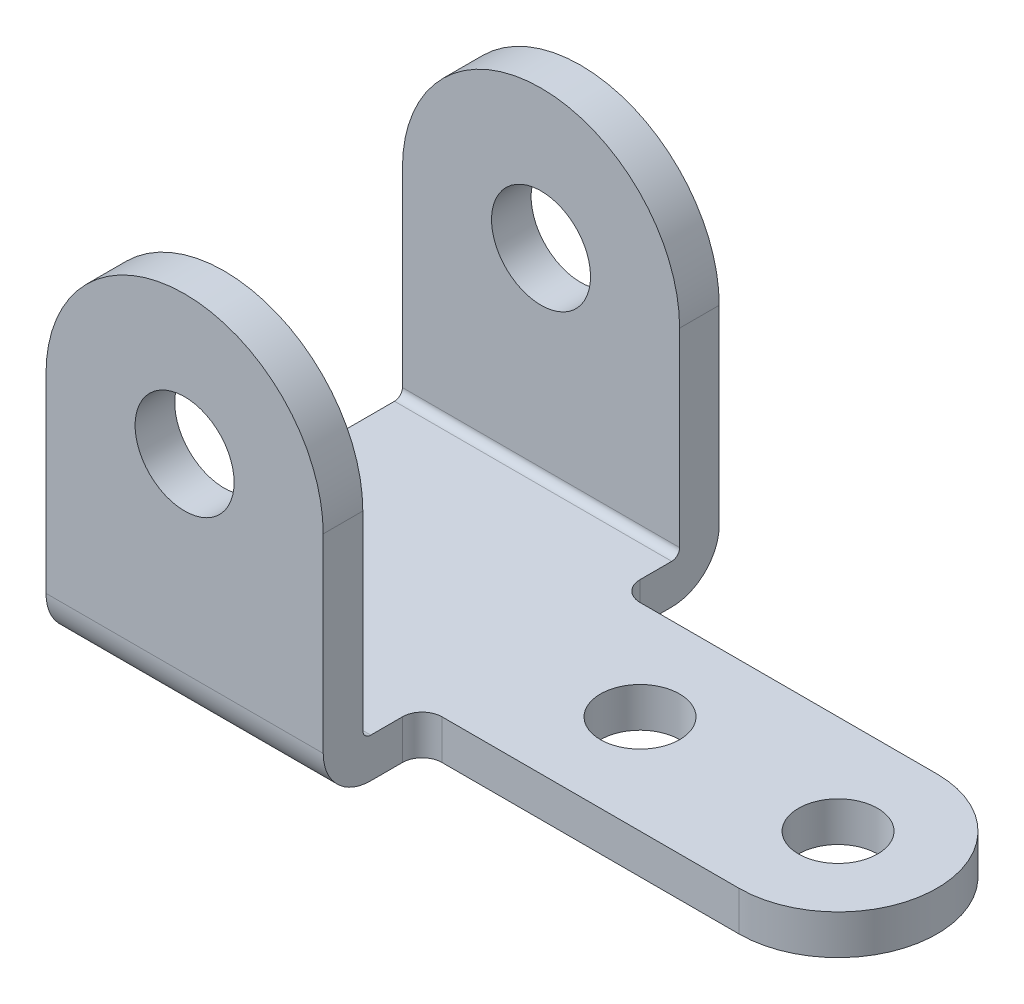
ISO-10303-21;
HEADER;
FILE_DESCRIPTION(('STEP AP214'),'2;1');
FILE_NAME('part.step','',(''),(''),'','','');
FILE_SCHEMA(('AUTOMOTIVE_DESIGN { 1 0 10303 214 1 1 1 1 }'));
ENDSEC;
DATA;
#1=APPLICATION_CONTEXT('core data for automotive mechanical design processes');
#2=APPLICATION_PROTOCOL_DEFINITION('international standard','automotive_design',2000,#1);
#3=PRODUCT_CONTEXT('',#1,'mechanical');
#4=PRODUCT('Part','Part','',(#3));
#5=PRODUCT_RELATED_PRODUCT_CATEGORY('part','',(#4));
#6=PRODUCT_DEFINITION_FORMATION('','',#4);
#7=PRODUCT_DEFINITION_CONTEXT('part definition',#1,'design');
#8=PRODUCT_DEFINITION('design','',#6,#7);
#9=PRODUCT_DEFINITION_SHAPE('','',#8);
#10=(LENGTH_UNIT() NAMED_UNIT(*) SI_UNIT(.MILLI.,.METRE.));
#11=(NAMED_UNIT(*) PLANE_ANGLE_UNIT() SI_UNIT($,.RADIAN.));
#12=(NAMED_UNIT(*) SI_UNIT($,.STERADIAN.) SOLID_ANGLE_UNIT());
#13=UNCERTAINTY_MEASURE_WITH_UNIT(LENGTH_MEASURE(1.E-05),#10,'distance_accuracy_value','');
#14=(GEOMETRIC_REPRESENTATION_CONTEXT(3) GLOBAL_UNCERTAINTY_ASSIGNED_CONTEXT((#13)) GLOBAL_UNIT_ASSIGNED_CONTEXT((#10,
#11,#12)) REPRESENTATION_CONTEXT('',''));
#15=CARTESIAN_POINT('',(0.,0.,0.));
#16=DIRECTION('',(0.,0.,1.));
#17=DIRECTION('',(1.,0.,0.));
#18=AXIS2_PLACEMENT_3D('',#15,#16,#17);
#19=CARTESIAN_POINT('',(35.,-60.,100.));
#20=DIRECTION('',(-1.,0.,0.));
#21=DIRECTION('',(0.,-1.,0.));
#22=AXIS2_PLACEMENT_3D('',#19,#20,#21);
#23=PLANE('',#22);
#24=DIRECTION('',(0.,0.,-1.));
#25=VECTOR('',#24,1.);
#26=CARTESIAN_POINT('',(35.,-60.,100.));
#27=LINE('',#26,#25);
#28=CARTESIAN_POINT('',(35.,-60.,88.));
#29=VERTEX_POINT('',#28);
#30=CARTESIAN_POINT('',(35.,-60.,80.));
#31=VERTEX_POINT('',#30);
#32=EDGE_CURVE('E258',#29,#31,#27,.T.);
#33=ORIENTED_EDGE('',*,*,#32,.T.);
#34=DIRECTION('',(0.,-1.,0.));
#35=VECTOR('',#34,1.);
#36=CARTESIAN_POINT('',(35.,-50.,80.));
#37=LINE('',#36,#35);
#38=CARTESIAN_POINT('',(35.,-50.,80.));
#39=VERTEX_POINT('',#38);
#40=EDGE_CURVE('E53',#31,#39,#37,.F.);
#41=ORIENTED_EDGE('',*,*,#40,.T.);
#42=DIRECTION('',(0.,0.,-1.));
#43=VECTOR('',#42,1.);
#44=CARTESIAN_POINT('',(35.,-50.,100.));
#45=LINE('',#44,#43);
#46=CARTESIAN_POINT('',(35.,-50.,88.));
#47=VERTEX_POINT('',#46);
#48=EDGE_CURVE('E212',#47,#39,#45,.T.);
#49=ORIENTED_EDGE('',*,*,#48,.F.);
#50=CARTESIAN_POINT('',(35.,-48.,88.));
#51=DIRECTION('',(-1.,0.,0.));
#52=DIRECTION('',(0.,-1.,0.));
#53=AXIS2_PLACEMENT_3D('',#50,#51,#52);
#54=CIRCLE('',#53,2.);
#55=CARTESIAN_POINT('',(35.,-48.,90.));
#56=VERTEX_POINT('',#55);
#57=EDGE_CURVE('E203',#56,#47,#54,.F.);
#58=ORIENTED_EDGE('',*,*,#57,.F.);
#59=DIRECTION('',(0.,1.,0.));
#60=VECTOR('',#59,1.);
#61=CARTESIAN_POINT('',(35.,-60.,90.));
#62=LINE('',#61,#60);
#63=CARTESIAN_POINT('',(35.,0.,90.));
#64=VERTEX_POINT('',#63);
#65=EDGE_CURVE('E231',#56,#64,#62,.T.);
#66=ORIENTED_EDGE('',*,*,#65,.T.);
#67=DIRECTION('',(0.,0.,-1.));
#68=VECTOR('',#67,1.);
#69=CARTESIAN_POINT('',(35.,0.,100.));
#70=LINE('',#69,#68);
#71=CARTESIAN_POINT('',(35.,0.,100.));
#72=VERTEX_POINT('',#71);
#73=EDGE_CURVE('E254',#72,#64,#70,.T.);
#74=ORIENTED_EDGE('',*,*,#73,.F.);
#75=DIRECTION('',(0.,1.,0.));
#76=VECTOR('',#75,1.);
#77=CARTESIAN_POINT('',(35.,-60.,100.));
#78=LINE('',#77,#76);
#79=CARTESIAN_POINT('',(35.,-48.,100.));
#80=VERTEX_POINT('',#79);
#81=EDGE_CURVE('E244',#80,#72,#78,.T.);
#82=ORIENTED_EDGE('',*,*,#81,.F.);
#83=CARTESIAN_POINT('',(35.,-48.,88.));
#84=DIRECTION('',(-1.,0.,0.));
#85=DIRECTION('',(0.,-1.,0.));
#86=AXIS2_PLACEMENT_3D('',#83,#84,#85);
#87=CIRCLE('',#86,12.);
#88=EDGE_CURVE('E272',#80,#29,#87,.F.);
#89=ORIENTED_EDGE('',*,*,#88,.T.);
#90=EDGE_LOOP('',(#33,#41,#49,#58,#66,#74,#82,#89));
#91=FACE_BOUND('',#90,.T.);
#92=ADVANCED_FACE('F32',(#91),#23,.F.);
#93=CARTESIAN_POINT('',(0.,0.,100.));
#94=DIRECTION('',(0.,0.,-1.));
#95=DIRECTION('',(-1.,0.,0.));
#96=AXIS2_PLACEMENT_3D('',#93,#94,#95);
#97=CYLINDRICAL_SURFACE('',#96,35.);
#98=CARTESIAN_POINT('',(0.,0.,9.99999999999999));
#99=DIRECTION('',(0.,0.,1.));
#100=DIRECTION('',(1.,0.,0.));
#101=AXIS2_PLACEMENT_3D('',#98,#99,#100);
#102=CIRCLE('',#101,35.);
#103=CARTESIAN_POINT('',(35.,0.,9.99999999999999));
#104=VERTEX_POINT('',#103);
#105=CARTESIAN_POINT('',(-35.,0.,9.99999999999999));
#106=VERTEX_POINT('',#105);
#107=EDGE_CURVE('E196',#104,#106,#102,.T.);
#108=ORIENTED_EDGE('',*,*,#107,.F.);
#109=CARTESIAN_POINT('',(35.,0.,0.));
#110=VERTEX_POINT('',#109);
#111=EDGE_CURVE('E246',#104,#110,#70,.T.);
#112=ORIENTED_EDGE('',*,*,#111,.T.);
#113=CARTESIAN_POINT('',(0.,0.,0.));
#114=DIRECTION('',(0.,0.,1.));
#115=DIRECTION('',(1.,0.,0.));
#116=AXIS2_PLACEMENT_3D('',#113,#114,#115);
#117=CIRCLE('',#116,35.);
#118=CARTESIAN_POINT('',(-35.,0.,0.));
#119=VERTEX_POINT('',#118);
#120=EDGE_CURVE('E210',#110,#119,#117,.T.);
#121=ORIENTED_EDGE('',*,*,#120,.T.);
#122=DIRECTION('',(0.,0.,-1.));
#123=VECTOR('',#122,1.);
#124=CARTESIAN_POINT('',(-35.,0.,100.));
#125=LINE('',#124,#123);
#126=EDGE_CURVE('E263',#106,#119,#125,.T.);
#127=ORIENTED_EDGE('',*,*,#126,.F.);
#128=EDGE_LOOP('',(#108,#112,#121,#127));
#129=FACE_BOUND('',#128,.T.);
#130=ADVANCED_FACE('F369',(#129),#97,.T.);
#131=ORIENTED_EDGE('',*,*,#73,.T.);
#132=CARTESIAN_POINT('',(0.,0.,90.));
#133=DIRECTION('',(0.,0.,1.));
#134=DIRECTION('',(1.,0.,0.));
#135=AXIS2_PLACEMENT_3D('',#132,#133,#134);
#136=CIRCLE('',#135,35.);
#137=CARTESIAN_POINT('',(-35.,0.,90.));
#138=VERTEX_POINT('',#137);
#139=EDGE_CURVE('E219',#64,#138,#136,.T.);
#140=ORIENTED_EDGE('',*,*,#139,.T.);
#141=CARTESIAN_POINT('',(-35.,0.,100.));
#142=VERTEX_POINT('',#141);
#143=EDGE_CURVE('E264',#142,#138,#125,.T.);
#144=ORIENTED_EDGE('',*,*,#143,.F.);
#145=CARTESIAN_POINT('',(0.,0.,100.));
#146=DIRECTION('',(0.,0.,1.));
#147=DIRECTION('',(1.,0.,0.));
#148=AXIS2_PLACEMENT_3D('',#145,#146,#147);
#149=CIRCLE('',#148,35.);
#150=EDGE_CURVE('E237',#72,#142,#149,.T.);
#151=ORIENTED_EDGE('',*,*,#150,.F.);
#152=EDGE_LOOP('',(#131,#140,#144,#151));
#153=FACE_BOUND('',#152,.T.);
#154=ADVANCED_FACE('F342',(#153),#97,.T.);
#155=CARTESIAN_POINT('',(-35.,0.,100.));
#156=DIRECTION('',(1.,0.,0.));
#157=DIRECTION('',(0.,1.,0.));
#158=AXIS2_PLACEMENT_3D('',#155,#156,#157);
#159=PLANE('',#158);
#160=ORIENTED_EDGE('',*,*,#143,.T.);
#161=DIRECTION('',(0.,-1.,0.));
#162=VECTOR('',#161,1.);
#163=CARTESIAN_POINT('',(-35.,0.,90.));
#164=LINE('',#163,#162);
#165=CARTESIAN_POINT('',(-35.,-48.,90.));
#166=VERTEX_POINT('',#165);
#167=EDGE_CURVE('E228',#138,#166,#164,.T.);
#168=ORIENTED_EDGE('',*,*,#167,.T.);
#169=CARTESIAN_POINT('',(-35.,-48.,88.));
#170=DIRECTION('',(1.,0.,0.));
#171=DIRECTION('',(0.,1.,0.));
#172=AXIS2_PLACEMENT_3D('',#169,#170,#171);
#173=CIRCLE('',#172,2.);
#174=CARTESIAN_POINT('',(-35.,-50.,88.));
#175=VERTEX_POINT('',#174);
#176=EDGE_CURVE('E211',#175,#166,#173,.F.);
#177=ORIENTED_EDGE('',*,*,#176,.F.);
#178=DIRECTION('',(0.,0.,-1.));
#179=VECTOR('',#178,1.);
#180=CARTESIAN_POINT('',(-35.,-50.,100.));
#181=LINE('',#180,#179);
#182=CARTESIAN_POINT('',(-35.,-50.,12.));
#183=VERTEX_POINT('',#182);
#184=EDGE_CURVE('E207',#175,#183,#181,.T.);
#185=ORIENTED_EDGE('',*,*,#184,.T.);
#186=CARTESIAN_POINT('',(-35.,-48.,12.));
#187=DIRECTION('',(1.,0.,0.));
#188=DIRECTION('',(0.,1.,0.));
#189=AXIS2_PLACEMENT_3D('',#186,#187,#188);
#190=CIRCLE('',#189,2.);
#191=CARTESIAN_POINT('',(-35.,-48.,10.));
#192=VERTEX_POINT('',#191);
#193=EDGE_CURVE('E199',#192,#183,#190,.F.);
#194=ORIENTED_EDGE('',*,*,#193,.F.);
#195=DIRECTION('',(0.,-1.,0.));
#196=VECTOR('',#195,1.);
#197=CARTESIAN_POINT('',(-35.,0.,9.99999999999999));
#198=LINE('',#197,#196);
#199=EDGE_CURVE('E220',#106,#192,#198,.T.);
#200=ORIENTED_EDGE('',*,*,#199,.F.);
#201=ORIENTED_EDGE('',*,*,#126,.T.);
#202=DIRECTION('',(0.,-1.,0.));
#203=VECTOR('',#202,1.);
#204=CARTESIAN_POINT('',(-35.,0.,0.));
#205=LINE('',#204,#203);
#206=CARTESIAN_POINT('',(-35.,-48.,0.));
#207=VERTEX_POINT('',#206);
#208=EDGE_CURVE('E249',#119,#207,#205,.T.);
#209=ORIENTED_EDGE('',*,*,#208,.T.);
#210=CARTESIAN_POINT('',(-35.,-48.,12.));
#211=DIRECTION('',(1.,0.,0.));
#212=DIRECTION('',(0.,1.,0.));
#213=AXIS2_PLACEMENT_3D('',#210,#211,#212);
#214=CIRCLE('',#213,12.);
#215=CARTESIAN_POINT('',(-35.,-60.,12.));
#216=VERTEX_POINT('',#215);
#217=EDGE_CURVE('E279',#207,#216,#214,.F.);
#218=ORIENTED_EDGE('',*,*,#217,.T.);
#219=DIRECTION('',(0.,0.,-1.));
#220=VECTOR('',#219,1.);
#221=CARTESIAN_POINT('',(-35.,-60.,100.));
#222=LINE('',#221,#220);
#223=CARTESIAN_POINT('',(-35.,-60.,88.));
#224=VERTEX_POINT('',#223);
#225=EDGE_CURVE('E260',#224,#216,#222,.T.);
#226=ORIENTED_EDGE('',*,*,#225,.F.);
#227=CARTESIAN_POINT('',(-35.,-48.,88.));
#228=DIRECTION('',(1.,0.,0.));
#229=DIRECTION('',(0.,1.,0.));
#230=AXIS2_PLACEMENT_3D('',#227,#228,#229);
#231=CIRCLE('',#230,12.);
#232=CARTESIAN_POINT('',(-35.,-48.,100.));
#233=VERTEX_POINT('',#232);
#234=EDGE_CURVE('E281',#224,#233,#231,.F.);
#235=ORIENTED_EDGE('',*,*,#234,.T.);
#236=DIRECTION('',(0.,-1.,0.));
#237=VECTOR('',#236,1.);
#238=CARTESIAN_POINT('',(-35.,0.,100.));
#239=LINE('',#238,#237);
#240=EDGE_CURVE('E240',#142,#233,#239,.T.);
#241=ORIENTED_EDGE('',*,*,#240,.F.);
#242=EDGE_LOOP('',(#160,#168,#177,#185,#194,#200,#201,#209,#218,#226,#235,#241));
#243=FACE_BOUND('',#242,.T.);
#244=ADVANCED_FACE('F345',(#243),#159,.F.);
#245=CARTESIAN_POINT('',(-35.,-60.,100.));
#246=DIRECTION('',(0.,1.,0.));
#247=DIRECTION('',(0.,0.,1.));
#248=AXIS2_PLACEMENT_3D('',#245,#246,#247);
#249=PLANE('',#248);
#250=CARTESIAN_POINT('',(115.,-60.,50.));
#251=DIRECTION('',(0.,-1.,0.));
#252=DIRECTION('',(1.,0.,0.));
#253=AXIS2_PLACEMENT_3D('',#250,#251,#252);
#254=CIRCLE('',#253,10.);
#255=CARTESIAN_POINT('',(125.,-60.,50.));
#256=VERTEX_POINT('',#255);
#257=EDGE_CURVE('E295',#256,#256,#254,.T.);
#258=ORIENTED_EDGE('',*,*,#257,.F.);
#259=EDGE_LOOP('',(#258));
#260=FACE_BOUND('',#259,.T.);
#261=CARTESIAN_POINT('',(65.,-60.,50.));
#262=DIRECTION('',(0.,-1.,0.));
#263=DIRECTION('',(1.,0.,0.));
#264=AXIS2_PLACEMENT_3D('',#261,#262,#263);
#265=CIRCLE('',#264,9.99999999999999);
#266=CARTESIAN_POINT('',(75.,-60.,50.));
#267=VERTEX_POINT('',#266);
#268=EDGE_CURVE('E291',#267,#267,#265,.T.);
#269=ORIENTED_EDGE('',*,*,#268,.F.);
#270=EDGE_LOOP('',(#269));
#271=FACE_BOUND('',#270,.T.);
#272=ORIENTED_EDGE('',*,*,#32,.F.);
#273=DIRECTION('',(1.,0.,0.));
#274=VECTOR('',#273,1.);
#275=CARTESIAN_POINT('',(-35.,-60.,88.));
#276=LINE('',#275,#274);
#277=EDGE_CURVE('E277',#29,#224,#276,.F.);
#278=ORIENTED_EDGE('',*,*,#277,.T.);
#279=ORIENTED_EDGE('',*,*,#225,.T.);
#280=DIRECTION('',(1.,0.,0.));
#281=VECTOR('',#280,1.);
#282=CARTESIAN_POINT('',(-35.,-60.,12.));
#283=LINE('',#282,#281);
#284=CARTESIAN_POINT('',(35.,-60.,12.));
#285=VERTEX_POINT('',#284);
#286=EDGE_CURVE('E274',#216,#285,#283,.T.);
#287=ORIENTED_EDGE('',*,*,#286,.T.);
#288=CARTESIAN_POINT('',(35.,-60.,20.));
#289=VERTEX_POINT('',#288);
#290=EDGE_CURVE('E257',#289,#285,#27,.T.);
#291=ORIENTED_EDGE('',*,*,#290,.F.);
#292=CARTESIAN_POINT('',(40.,-60.,20.));
#293=DIRECTION('',(0.,1.,0.));
#294=DIRECTION('',(0.,0.,1.));
#295=AXIS2_PLACEMENT_3D('',#292,#293,#294);
#296=CIRCLE('',#295,5.);
#297=CARTESIAN_POINT('',(40.,-60.,25.));
#298=VERTEX_POINT('',#297);
#299=EDGE_CURVE('E303',#289,#298,#296,.T.);
#300=ORIENTED_EDGE('',*,*,#299,.T.);
#301=DIRECTION('',(1.,0.,0.));
#302=VECTOR('',#301,1.);
#303=CARTESIAN_POINT('',(35.,-60.,25.));
#304=LINE('',#303,#302);
#305=CARTESIAN_POINT('',(115.,-60.,25.));
#306=VERTEX_POINT('',#305);
#307=EDGE_CURVE('E317',#298,#306,#304,.T.);
#308=ORIENTED_EDGE('',*,*,#307,.T.);
#309=CARTESIAN_POINT('',(115.,-60.,50.));
#310=DIRECTION('',(0.,-1.,0.));
#311=DIRECTION('',(0.,0.,-1.));
#312=AXIS2_PLACEMENT_3D('',#309,#310,#311);
#313=CIRCLE('',#312,25.);
#314=CARTESIAN_POINT('',(115.,-60.,75.));
#315=VERTEX_POINT('',#314);
#316=EDGE_CURVE('E168',#306,#315,#313,.T.);
#317=ORIENTED_EDGE('',*,*,#316,.T.);
#318=DIRECTION('',(1.,0.,0.));
#319=VECTOR('',#318,1.);
#320=CARTESIAN_POINT('',(35.,-60.,75.));
#321=LINE('',#320,#319);
#322=CARTESIAN_POINT('',(40.,-60.,75.));
#323=VERTEX_POINT('',#322);
#324=EDGE_CURVE('E192',#323,#315,#321,.T.);
#325=ORIENTED_EDGE('',*,*,#324,.F.);
#326=CARTESIAN_POINT('',(40.,-60.,80.));
#327=DIRECTION('',(0.,1.,0.));
#328=DIRECTION('',(0.,0.,1.));
#329=AXIS2_PLACEMENT_3D('',#326,#327,#328);
#330=CIRCLE('',#329,5.);
#331=EDGE_CURVE('E40',#323,#31,#330,.T.);
#332=ORIENTED_EDGE('',*,*,#331,.T.);
#333=EDGE_LOOP('',(#272,#278,#279,#287,#291,#300,#308,#317,#325,#332));
#334=FACE_BOUND('',#333,.T.);
#335=ADVANCED_FACE('F316',(#260,#271,#334),#249,.F.);
#336=CARTESIAN_POINT('',(35.,-50.,20.));
#337=VERTEX_POINT('',#336);
#338=CARTESIAN_POINT('',(35.,-50.,12.));
#339=VERTEX_POINT('',#338);
#340=EDGE_CURVE('E214',#337,#339,#45,.T.);
#341=ORIENTED_EDGE('',*,*,#340,.F.);
#342=DIRECTION('',(0.,-1.,0.));
#343=VECTOR('',#342,1.);
#344=CARTESIAN_POINT('',(35.,-60.,20.));
#345=LINE('',#344,#343);
#346=EDGE_CURVE('E285',#337,#289,#345,.T.);
#347=ORIENTED_EDGE('',*,*,#346,.T.);
#348=ORIENTED_EDGE('',*,*,#290,.T.);
#349=CARTESIAN_POINT('',(35.,-48.,12.));
#350=DIRECTION('',(-1.,0.,0.));
#351=DIRECTION('',(0.,-1.,0.));
#352=AXIS2_PLACEMENT_3D('',#349,#350,#351);
#353=CIRCLE('',#352,12.);
#354=CARTESIAN_POINT('',(35.,-48.,0.));
#355=VERTEX_POINT('',#354);
#356=EDGE_CURVE('E270',#285,#355,#353,.F.);
#357=ORIENTED_EDGE('',*,*,#356,.T.);
#358=DIRECTION('',(0.,1.,0.));
#359=VECTOR('',#358,1.);
#360=CARTESIAN_POINT('',(35.,-60.,0.));
#361=LINE('',#360,#359);
#362=EDGE_CURVE('E241',#355,#110,#361,.T.);
#363=ORIENTED_EDGE('',*,*,#362,.T.);
#364=ORIENTED_EDGE('',*,*,#111,.F.);
#365=DIRECTION('',(0.,1.,0.));
#366=VECTOR('',#365,1.);
#367=CARTESIAN_POINT('',(35.,-60.,9.99999999999999));
#368=LINE('',#367,#366);
#369=CARTESIAN_POINT('',(35.,-48.,10.));
#370=VERTEX_POINT('',#369);
#371=EDGE_CURVE('E217',#370,#104,#368,.T.);
#372=ORIENTED_EDGE('',*,*,#371,.F.);
#373=CARTESIAN_POINT('',(35.,-48.,12.));
#374=DIRECTION('',(-1.,0.,0.));
#375=DIRECTION('',(0.,-1.,0.));
#376=AXIS2_PLACEMENT_3D('',#373,#374,#375);
#377=CIRCLE('',#376,2.);
#378=EDGE_CURVE('E206',#339,#370,#377,.F.);
#379=ORIENTED_EDGE('',*,*,#378,.F.);
#380=EDGE_LOOP('',(#341,#347,#348,#357,#363,#364,#372,#379));
#381=FACE_BOUND('',#380,.T.);
#382=ADVANCED_FACE('F312',(#381),#23,.F.);
#383=CARTESIAN_POINT('',(0.,0.,100.));
#384=DIRECTION('',(0.,0.,1.));
#385=DIRECTION('',(1.,0.,0.));
#386=AXIS2_PLACEMENT_3D('',#383,#384,#385);
#387=PLANE('',#386);
#388=CARTESIAN_POINT('',(0.,0.,100.));
#389=DIRECTION('',(0.,0.,1.));
#390=DIRECTION('',(1.,0.,0.));
#391=AXIS2_PLACEMENT_3D('',#388,#389,#390);
#392=CIRCLE('',#391,12.5);
#393=CARTESIAN_POINT('',(12.5,0.,100.));
#394=VERTEX_POINT('',#393);
#395=EDGE_CURVE('E189',#394,#394,#392,.T.);
#396=ORIENTED_EDGE('',*,*,#395,.F.);
#397=EDGE_LOOP('',(#396));
#398=FACE_BOUND('',#397,.T.);
#399=ORIENTED_EDGE('',*,*,#240,.T.);
#400=DIRECTION('',(1.,0.,0.));
#401=VECTOR('',#400,1.);
#402=CARTESIAN_POINT('',(35.,-48.,100.));
#403=LINE('',#402,#401);
#404=EDGE_CURVE('E267',#233,#80,#403,.T.);
#405=ORIENTED_EDGE('',*,*,#404,.T.);
#406=ORIENTED_EDGE('',*,*,#81,.T.);
#407=ORIENTED_EDGE('',*,*,#150,.T.);
#408=EDGE_LOOP('',(#399,#405,#406,#407));
#409=FACE_BOUND('',#408,.T.);
#410=ADVANCED_FACE('F350',(#398,#409),#387,.T.);
#411=CARTESIAN_POINT('',(0.,0.,0.));
#412=DIRECTION('',(0.,0.,1.));
#413=DIRECTION('',(1.,0.,0.));
#414=AXIS2_PLACEMENT_3D('',#411,#412,#413);
#415=PLANE('',#414);
#416=CARTESIAN_POINT('',(0.,0.,0.));
#417=DIRECTION('',(0.,0.,1.));
#418=DIRECTION('',(1.,0.,0.));
#419=AXIS2_PLACEMENT_3D('',#416,#417,#418);
#420=CIRCLE('',#419,12.5);
#421=CARTESIAN_POINT('',(12.5,0.,0.));
#422=VERTEX_POINT('',#421);
#423=EDGE_CURVE('E185',#422,#422,#420,.T.);
#424=ORIENTED_EDGE('',*,*,#423,.T.);
#425=EDGE_LOOP('',(#424));
#426=FACE_BOUND('',#425,.T.);
#427=ORIENTED_EDGE('',*,*,#362,.F.);
#428=DIRECTION('',(1.,0.,0.));
#429=VECTOR('',#428,1.);
#430=CARTESIAN_POINT('',(0.,-48.,0.));
#431=LINE('',#430,#429);
#432=EDGE_CURVE('E283',#355,#207,#431,.F.);
#433=ORIENTED_EDGE('',*,*,#432,.T.);
#434=ORIENTED_EDGE('',*,*,#208,.F.);
#435=ORIENTED_EDGE('',*,*,#120,.F.);
#436=EDGE_LOOP('',(#427,#433,#434,#435));
#437=FACE_BOUND('',#436,.T.);
#438=ADVANCED_FACE('F357',(#426,#437),#415,.F.);
#439=CARTESIAN_POINT('',(0.,-48.,88.));
#440=DIRECTION('',(-1.,0.,0.));
#441=DIRECTION('',(0.,0.,1.));
#442=AXIS2_PLACEMENT_3D('',#439,#440,#441);
#443=CYLINDRICAL_SURFACE('',#442,12.);
#444=ORIENTED_EDGE('',*,*,#234,.F.);
#445=ORIENTED_EDGE('',*,*,#277,.F.);
#446=ORIENTED_EDGE('',*,*,#88,.F.);
#447=ORIENTED_EDGE('',*,*,#404,.F.);
#448=EDGE_LOOP('',(#444,#445,#446,#447));
#449=FACE_BOUND('',#448,.T.);
#450=ADVANCED_FACE('F354',(#449),#443,.T.);
#451=CARTESIAN_POINT('',(-35.,-48.,12.));
#452=DIRECTION('',(1.,0.,0.));
#453=DIRECTION('',(0.,0.,-1.));
#454=AXIS2_PLACEMENT_3D('',#451,#452,#453);
#455=CYLINDRICAL_SURFACE('',#454,12.);
#456=ORIENTED_EDGE('',*,*,#217,.F.);
#457=ORIENTED_EDGE('',*,*,#432,.F.);
#458=ORIENTED_EDGE('',*,*,#356,.F.);
#459=ORIENTED_EDGE('',*,*,#286,.F.);
#460=EDGE_LOOP('',(#456,#457,#458,#459));
#461=FACE_BOUND('',#460,.T.);
#462=ADVANCED_FACE('F356',(#461),#455,.T.);
#463=CARTESIAN_POINT('',(-35.,-50.,100.));
#464=DIRECTION('',(0.,1.,0.));
#465=DIRECTION('',(0.,0.,1.));
#466=AXIS2_PLACEMENT_3D('',#463,#464,#465);
#467=PLANE('',#466);
#468=CARTESIAN_POINT('',(115.,-50.,50.));
#469=DIRECTION('',(0.,1.,0.));
#470=DIRECTION('',(0.,0.,1.));
#471=AXIS2_PLACEMENT_3D('',#468,#469,#470);
#472=CIRCLE('',#471,10.);
#473=CARTESIAN_POINT('',(115.,-50.,60.));
#474=VERTEX_POINT('',#473);
#475=EDGE_CURVE('E292',#474,#474,#472,.T.);
#476=ORIENTED_EDGE('',*,*,#475,.F.);
#477=EDGE_LOOP('',(#476));
#478=FACE_BOUND('',#477,.T.);
#479=CARTESIAN_POINT('',(65.,-50.,50.));
#480=DIRECTION('',(0.,1.,0.));
#481=DIRECTION('',(0.,0.,1.));
#482=AXIS2_PLACEMENT_3D('',#479,#480,#481);
#483=CIRCLE('',#482,9.99999999999999);
#484=CARTESIAN_POINT('',(65.,-50.,60.));
#485=VERTEX_POINT('',#484);
#486=EDGE_CURVE('E288',#485,#485,#483,.T.);
#487=ORIENTED_EDGE('',*,*,#486,.F.);
#488=EDGE_LOOP('',(#487));
#489=FACE_BOUND('',#488,.T.);
#490=ORIENTED_EDGE('',*,*,#48,.T.);
#491=CARTESIAN_POINT('',(40.,-50.,80.));
#492=DIRECTION('',(0.,1.,0.));
#493=DIRECTION('',(0.,0.,1.));
#494=AXIS2_PLACEMENT_3D('',#491,#492,#493);
#495=CIRCLE('',#494,5.);
#496=CARTESIAN_POINT('',(40.,-50.,75.));
#497=VERTEX_POINT('',#496);
#498=EDGE_CURVE('E11',#39,#497,#495,.F.);
#499=ORIENTED_EDGE('',*,*,#498,.T.);
#500=DIRECTION('',(1.,0.,0.));
#501=VECTOR('',#500,1.);
#502=CARTESIAN_POINT('',(35.,-50.,75.));
#503=LINE('',#502,#501);
#504=CARTESIAN_POINT('',(115.,-50.,75.));
#505=VERTEX_POINT('',#504);
#506=EDGE_CURVE('E174',#497,#505,#503,.T.);
#507=ORIENTED_EDGE('',*,*,#506,.T.);
#508=CARTESIAN_POINT('',(115.,-50.,50.));
#509=DIRECTION('',(0.,1.,0.));
#510=DIRECTION('',(0.,0.,1.));
#511=AXIS2_PLACEMENT_3D('',#508,#509,#510);
#512=CIRCLE('',#511,25.);
#513=CARTESIAN_POINT('',(115.,-50.,25.));
#514=VERTEX_POINT('',#513);
#515=EDGE_CURVE('E171',#514,#505,#512,.F.);
#516=ORIENTED_EDGE('',*,*,#515,.F.);
#517=DIRECTION('',(1.,0.,0.));
#518=VECTOR('',#517,1.);
#519=CARTESIAN_POINT('',(35.,-50.,25.));
#520=LINE('',#519,#518);
#521=CARTESIAN_POINT('',(40.,-50.,25.));
#522=VERTEX_POINT('',#521);
#523=EDGE_CURVE('E157',#522,#514,#520,.T.);
#524=ORIENTED_EDGE('',*,*,#523,.F.);
#525=CARTESIAN_POINT('',(40.,-50.,20.));
#526=DIRECTION('',(0.,1.,0.));
#527=DIRECTION('',(0.,0.,1.));
#528=AXIS2_PLACEMENT_3D('',#525,#526,#527);
#529=CIRCLE('',#528,5.);
#530=EDGE_CURVE('E305',#522,#337,#529,.F.);
#531=ORIENTED_EDGE('',*,*,#530,.T.);
#532=ORIENTED_EDGE('',*,*,#340,.T.);
#533=DIRECTION('',(1.,0.,0.));
#534=VECTOR('',#533,1.);
#535=CARTESIAN_POINT('',(-35.,-50.,12.));
#536=LINE('',#535,#534);
#537=EDGE_CURVE('E200',#183,#339,#536,.T.);
#538=ORIENTED_EDGE('',*,*,#537,.F.);
#539=ORIENTED_EDGE('',*,*,#184,.F.);
#540=DIRECTION('',(1.,0.,0.));
#541=VECTOR('',#540,1.);
#542=CARTESIAN_POINT('',(-35.,-50.,88.));
#543=LINE('',#542,#541);
#544=EDGE_CURVE('E197',#47,#175,#543,.F.);
#545=ORIENTED_EDGE('',*,*,#544,.F.);
#546=EDGE_LOOP('',(#490,#499,#507,#516,#524,#531,#532,#538,#539,#545));
#547=FACE_BOUND('',#546,.T.);
#548=ADVANCED_FACE('F172',(#478,#489,#547),#467,.T.);
#549=CARTESIAN_POINT('',(0.,0.,90.));
#550=DIRECTION('',(0.,0.,1.));
#551=DIRECTION('',(1.,0.,0.));
#552=AXIS2_PLACEMENT_3D('',#549,#550,#551);
#553=PLANE('',#552);
#554=CARTESIAN_POINT('',(0.,0.,90.));
#555=DIRECTION('',(0.,0.,1.));
#556=DIRECTION('',(1.,0.,0.));
#557=AXIS2_PLACEMENT_3D('',#554,#555,#556);
#558=CIRCLE('',#557,12.5);
#559=CARTESIAN_POINT('',(12.5,0.,90.));
#560=VERTEX_POINT('',#559);
#561=EDGE_CURVE('E193',#560,#560,#558,.T.);
#562=ORIENTED_EDGE('',*,*,#561,.T.);
#563=EDGE_LOOP('',(#562));
#564=FACE_BOUND('',#563,.T.);
#565=ORIENTED_EDGE('',*,*,#167,.F.);
#566=ORIENTED_EDGE('',*,*,#139,.F.);
#567=ORIENTED_EDGE('',*,*,#65,.F.);
#568=DIRECTION('',(1.,0.,0.));
#569=VECTOR('',#568,1.);
#570=CARTESIAN_POINT('',(0.,-48.,90.));
#571=LINE('',#570,#569);
#572=EDGE_CURVE('E204',#166,#56,#571,.T.);
#573=ORIENTED_EDGE('',*,*,#572,.F.);
#574=EDGE_LOOP('',(#565,#566,#567,#573));
#575=FACE_BOUND('',#574,.T.);
#576=ADVANCED_FACE('F339',(#564,#575),#553,.F.);
#577=CARTESIAN_POINT('',(0.,0.,10.));
#578=DIRECTION('',(0.,0.,1.));
#579=DIRECTION('',(1.,0.,0.));
#580=AXIS2_PLACEMENT_3D('',#577,#578,#579);
#581=PLANE('',#580);
#582=CARTESIAN_POINT('',(0.,0.,10.));
#583=DIRECTION('',(0.,0.,1.));
#584=DIRECTION('',(1.,0.,0.));
#585=AXIS2_PLACEMENT_3D('',#582,#583,#584);
#586=CIRCLE('',#585,12.5);
#587=CARTESIAN_POINT('',(12.5,0.,10.));
#588=VERTEX_POINT('',#587);
#589=EDGE_CURVE('E188',#588,#588,#586,.T.);
#590=ORIENTED_EDGE('',*,*,#589,.F.);
#591=EDGE_LOOP('',(#590));
#592=FACE_BOUND('',#591,.T.);
#593=ORIENTED_EDGE('',*,*,#371,.T.);
#594=ORIENTED_EDGE('',*,*,#107,.T.);
#595=ORIENTED_EDGE('',*,*,#199,.T.);
#596=DIRECTION('',(1.,0.,0.));
#597=VECTOR('',#596,1.);
#598=CARTESIAN_POINT('',(0.,-48.,10.));
#599=LINE('',#598,#597);
#600=EDGE_CURVE('E208',#370,#192,#599,.F.);
#601=ORIENTED_EDGE('',*,*,#600,.F.);
#602=EDGE_LOOP('',(#593,#594,#595,#601));
#603=FACE_BOUND('',#602,.T.);
#604=ADVANCED_FACE('F410',(#592,#603),#581,.T.);
#605=CARTESIAN_POINT('',(0.,-48.,88.));
#606=DIRECTION('',(-1.,0.,0.));
#607=DIRECTION('',(0.,0.,1.));
#608=AXIS2_PLACEMENT_3D('',#605,#606,#607);
#609=CYLINDRICAL_SURFACE('',#608,2.);
#610=ORIENTED_EDGE('',*,*,#176,.T.);
#611=ORIENTED_EDGE('',*,*,#572,.T.);
#612=ORIENTED_EDGE('',*,*,#57,.T.);
#613=ORIENTED_EDGE('',*,*,#544,.T.);
#614=EDGE_LOOP('',(#610,#611,#612,#613));
#615=FACE_BOUND('',#614,.T.);
#616=ADVANCED_FACE('F335',(#615),#609,.F.);
#617=CARTESIAN_POINT('',(-35.,-48.,12.));
#618=DIRECTION('',(1.,0.,0.));
#619=DIRECTION('',(0.,0.,-1.));
#620=AXIS2_PLACEMENT_3D('',#617,#618,#619);
#621=CYLINDRICAL_SURFACE('',#620,2.);
#622=ORIENTED_EDGE('',*,*,#193,.T.);
#623=ORIENTED_EDGE('',*,*,#537,.T.);
#624=ORIENTED_EDGE('',*,*,#378,.T.);
#625=ORIENTED_EDGE('',*,*,#600,.T.);
#626=EDGE_LOOP('',(#622,#623,#624,#625));
#627=FACE_BOUND('',#626,.T.);
#628=ADVANCED_FACE('F409',(#627),#621,.F.);
#629=CARTESIAN_POINT('',(0.,0.,0.));
#630=DIRECTION('',(0.,0.,1.));
#631=DIRECTION('',(1.,0.,0.));
#632=AXIS2_PLACEMENT_3D('',#629,#630,#631);
#633=CYLINDRICAL_SURFACE('',#632,12.5);
#634=ORIENTED_EDGE('',*,*,#589,.T.);
#635=EDGE_LOOP('',(#634));
#636=FACE_BOUND('',#635,.T.);
#637=ORIENTED_EDGE('',*,*,#423,.F.);
#638=EDGE_LOOP('',(#637));
#639=FACE_BOUND('',#638,.T.);
#640=ADVANCED_FACE('F421',(#636,#639),#633,.F.);
#641=ORIENTED_EDGE('',*,*,#395,.T.);
#642=EDGE_LOOP('',(#641));
#643=FACE_BOUND('',#642,.T.);
#644=ORIENTED_EDGE('',*,*,#561,.F.);
#645=EDGE_LOOP('',(#644));
#646=FACE_BOUND('',#645,.T.);
#647=ADVANCED_FACE('F463',(#643,#646),#633,.F.);
#648=CARTESIAN_POINT('',(35.,66.2970334961301,25.));
#649=DIRECTION('',(0.,0.,-1.));
#650=DIRECTION('',(-1.,0.,0.));
#651=AXIS2_PLACEMENT_3D('',#648,#649,#650);
#652=PLANE('',#651);
#653=ORIENTED_EDGE('',*,*,#307,.F.);
#654=DIRECTION('',(0.,-1.,0.));
#655=VECTOR('',#654,1.);
#656=CARTESIAN_POINT('',(40.,66.2970334961301,25.));
#657=LINE('',#656,#655);
#658=EDGE_CURVE('E165',#298,#522,#657,.F.);
#659=ORIENTED_EDGE('',*,*,#658,.T.);
#660=ORIENTED_EDGE('',*,*,#523,.T.);
#661=DIRECTION('',(0.,-1.,0.));
#662=VECTOR('',#661,1.);
#663=CARTESIAN_POINT('',(115.,66.2970334961301,25.));
#664=LINE('',#663,#662);
#665=EDGE_CURVE('E162',#514,#306,#664,.T.);
#666=ORIENTED_EDGE('',*,*,#665,.T.);
#667=EDGE_LOOP('',(#653,#659,#660,#666));
#668=FACE_BOUND('',#667,.T.);
#669=ADVANCED_FACE('F160',(#668),#652,.T.);
#670=CARTESIAN_POINT('',(115.,66.2970334961301,50.));
#671=DIRECTION('',(0.,-1.,0.));
#672=DIRECTION('',(0.,0.,-1.));
#673=AXIS2_PLACEMENT_3D('',#670,#671,#672);
#674=CYLINDRICAL_SURFACE('',#673,25.);
#675=ORIENTED_EDGE('',*,*,#665,.F.);
#676=ORIENTED_EDGE('',*,*,#515,.T.);
#677=DIRECTION('',(0.,-1.,0.));
#678=VECTOR('',#677,1.);
#679=CARTESIAN_POINT('',(115.,66.2970334961301,75.));
#680=LINE('',#679,#678);
#681=EDGE_CURVE('E178',#505,#315,#680,.T.);
#682=ORIENTED_EDGE('',*,*,#681,.T.);
#683=ORIENTED_EDGE('',*,*,#316,.F.);
#684=EDGE_LOOP('',(#675,#676,#682,#683));
#685=FACE_BOUND('',#684,.T.);
#686=ADVANCED_FACE('F180',(#685),#674,.T.);
#687=CARTESIAN_POINT('',(35.,66.2970334961301,75.));
#688=DIRECTION('',(0.,0.,-1.));
#689=DIRECTION('',(-1.,0.,0.));
#690=AXIS2_PLACEMENT_3D('',#687,#688,#689);
#691=PLANE('',#690);
#692=ORIENTED_EDGE('',*,*,#506,.F.);
#693=DIRECTION('',(0.,-1.,0.));
#694=VECTOR('',#693,1.);
#695=CARTESIAN_POINT('',(40.,-60.,75.));
#696=LINE('',#695,#694);
#697=EDGE_CURVE('E299',#497,#323,#696,.T.);
#698=ORIENTED_EDGE('',*,*,#697,.T.);
#699=ORIENTED_EDGE('',*,*,#324,.T.);
#700=ORIENTED_EDGE('',*,*,#681,.F.);
#701=EDGE_LOOP('',(#692,#698,#699,#700));
#702=FACE_BOUND('',#701,.T.);
#703=ADVANCED_FACE('F325',(#702),#691,.F.);
#704=CARTESIAN_POINT('',(65.,35.,50.));
#705=DIRECTION('',(0.,-1.,0.));
#706=DIRECTION('',(1.,0.,0.));
#707=AXIS2_PLACEMENT_3D('',#704,#705,#706);
#708=CYLINDRICAL_SURFACE('',#707,9.99999999999999);
#709=ORIENTED_EDGE('',*,*,#486,.T.);
#710=EDGE_LOOP('',(#709));
#711=FACE_BOUND('',#710,.T.);
#712=ORIENTED_EDGE('',*,*,#268,.T.);
#713=EDGE_LOOP('',(#712));
#714=FACE_BOUND('',#713,.T.);
#715=ADVANCED_FACE('F490',(#711,#714),#708,.F.);
#716=CARTESIAN_POINT('',(115.,35.,50.));
#717=DIRECTION('',(0.,-1.,0.));
#718=DIRECTION('',(1.,0.,0.));
#719=AXIS2_PLACEMENT_3D('',#716,#717,#718);
#720=CYLINDRICAL_SURFACE('',#719,10.);
#721=ORIENTED_EDGE('',*,*,#475,.T.);
#722=EDGE_LOOP('',(#721));
#723=FACE_BOUND('',#722,.T.);
#724=ORIENTED_EDGE('',*,*,#257,.T.);
#725=EDGE_LOOP('',(#724));
#726=FACE_BOUND('',#725,.T.);
#727=ADVANCED_FACE('F495',(#723,#726),#720,.F.);
#728=CARTESIAN_POINT('',(40.,-60.,20.));
#729=DIRECTION('',(0.,-1.,0.));
#730=DIRECTION('',(1.,0.,0.));
#731=AXIS2_PLACEMENT_3D('',#728,#729,#730);
#732=CYLINDRICAL_SURFACE('',#731,5.);
#733=ORIENTED_EDGE('',*,*,#530,.F.);
#734=ORIENTED_EDGE('',*,*,#658,.F.);
#735=ORIENTED_EDGE('',*,*,#299,.F.);
#736=ORIENTED_EDGE('',*,*,#346,.F.);
#737=EDGE_LOOP('',(#733,#734,#735,#736));
#738=FACE_BOUND('',#737,.T.);
#739=ADVANCED_FACE('F315',(#738),#732,.F.);
#740=CARTESIAN_POINT('',(40.,66.2970334961301,80.));
#741=DIRECTION('',(0.,1.,0.));
#742=DIRECTION('',(-1.,0.,0.));
#743=AXIS2_PLACEMENT_3D('',#740,#741,#742);
#744=CYLINDRICAL_SURFACE('',#743,5.);
#745=ORIENTED_EDGE('',*,*,#498,.F.);
#746=ORIENTED_EDGE('',*,*,#40,.F.);
#747=ORIENTED_EDGE('',*,*,#331,.F.);
#748=ORIENTED_EDGE('',*,*,#697,.F.);
#749=EDGE_LOOP('',(#745,#746,#747,#748));
#750=FACE_BOUND('',#749,.T.);
#751=ADVANCED_FACE('F34',(#750),#744,.F.);
#752=CLOSED_SHELL('',(#92,#130,#154,#244,#335,#382,#410,#438,#450,#462,#548,#576,#604,#616,#628,
#640,#647,#669,#686,#703,#715,#727,#739,#751));
#753=MANIFOLD_SOLID_BREP('B2',#752);
#754=ADVANCED_BREP_SHAPE_REPRESENTATION('',(#18,#753),#14);
#755=SHAPE_DEFINITION_REPRESENTATION(#9,#754);
ENDSEC;
END-ISO-10303-21;
